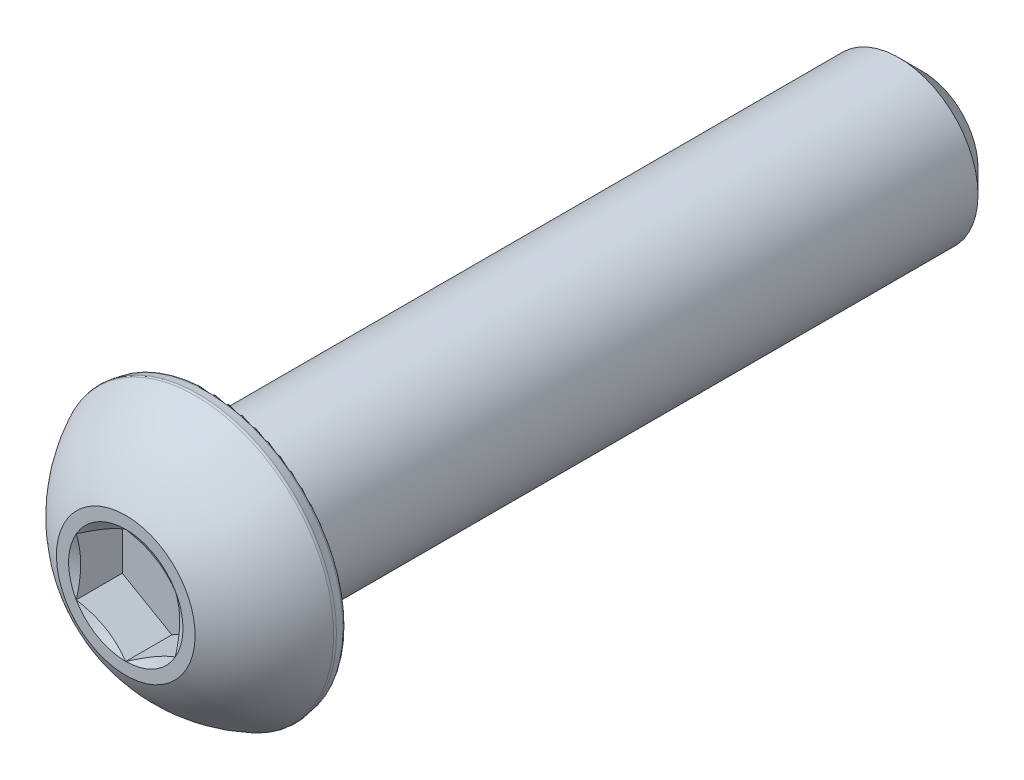
ISO-10303-21;
HEADER;
FILE_DESCRIPTION(('STEP AP214'),'2;1');
FILE_NAME('part.step','',(''),(''),'','','');
FILE_SCHEMA(('AUTOMOTIVE_DESIGN { 1 0 10303 214 1 1 1 1 }'));
ENDSEC;
DATA;
#1=APPLICATION_CONTEXT('core data for automotive mechanical design processes');
#2=APPLICATION_PROTOCOL_DEFINITION('international standard','automotive_design',2000,#1);
#3=PRODUCT_CONTEXT('',#1,'mechanical');
#4=PRODUCT('Part','Part','',(#3));
#5=PRODUCT_RELATED_PRODUCT_CATEGORY('part','',(#4));
#6=PRODUCT_DEFINITION_FORMATION('','',#4);
#7=PRODUCT_DEFINITION_CONTEXT('part definition',#1,'design');
#8=PRODUCT_DEFINITION('design','',#6,#7);
#9=PRODUCT_DEFINITION_SHAPE('','',#8);
#10=(LENGTH_UNIT() NAMED_UNIT(*) SI_UNIT(.MILLI.,.METRE.));
#11=(NAMED_UNIT(*) PLANE_ANGLE_UNIT() SI_UNIT($,.RADIAN.));
#12=(NAMED_UNIT(*) SI_UNIT($,.STERADIAN.) SOLID_ANGLE_UNIT());
#13=UNCERTAINTY_MEASURE_WITH_UNIT(LENGTH_MEASURE(1.E-05),#10,'distance_accuracy_value','');
#14=(GEOMETRIC_REPRESENTATION_CONTEXT(3) GLOBAL_UNCERTAINTY_ASSIGNED_CONTEXT((#13)) GLOBAL_UNIT_ASSIGNED_CONTEXT((#10,
#11,#12)) REPRESENTATION_CONTEXT('',''));
#15=CARTESIAN_POINT('',(0.,0.,0.));
#16=DIRECTION('',(0.,0.,1.));
#17=DIRECTION('',(1.,0.,0.));
#18=AXIS2_PLACEMENT_3D('',#15,#16,#17);
#19=CARTESIAN_POINT('',(0.,0.,15.9639));
#20=DIRECTION('',(0.,0.,-1.));
#21=DIRECTION('',(-1.,0.,0.));
#22=AXIS2_PLACEMENT_3D('',#19,#20,#21);
#23=PLANE('',#22);
#24=CARTESIAN_POINT('',(0.,0.,15.9639));
#25=DIRECTION('',(0.,0.,1.));
#26=DIRECTION('',(1.,0.,0.));
#27=AXIS2_PLACEMENT_3D('',#24,#25,#26);
#28=CIRCLE('',#27,2.29135888084633);
#29=CARTESIAN_POINT('',(-1.984375,1.14567944042316,15.9639));
#30=VERTEX_POINT('',#29);
#31=CARTESIAN_POINT('',(-1.984375,-1.14567944042316,15.9639));
#32=VERTEX_POINT('',#31);
#33=EDGE_CURVE('E87',#30,#32,#28,.T.);
#34=ORIENTED_EDGE('',*,*,#33,.F.);
#35=CARTESIAN_POINT('',(0.,2.29135888084633,15.9639));
#36=VERTEX_POINT('',#35);
#37=EDGE_CURVE('E96',#36,#30,#28,.T.);
#38=ORIENTED_EDGE('',*,*,#37,.F.);
#39=CARTESIAN_POINT('',(1.984375,1.14567944042316,15.9639));
#40=VERTEX_POINT('',#39);
#41=EDGE_CURVE('E47',#40,#36,#28,.T.);
#42=ORIENTED_EDGE('',*,*,#41,.F.);
#43=CARTESIAN_POINT('',(1.984375,-1.14567944042316,15.9639));
#44=VERTEX_POINT('',#43);
#45=EDGE_CURVE('E54',#44,#40,#28,.T.);
#46=ORIENTED_EDGE('',*,*,#45,.F.);
#47=CARTESIAN_POINT('',(0.,-2.29135888084633,15.9639));
#48=VERTEX_POINT('',#47);
#49=EDGE_CURVE('E129',#48,#44,#28,.T.);
#50=ORIENTED_EDGE('',*,*,#49,.F.);
#51=EDGE_CURVE('E97',#32,#48,#28,.T.);
#52=ORIENTED_EDGE('',*,*,#51,.F.);
#53=EDGE_LOOP('',(#34,#38,#42,#46,#50,#52));
#54=FACE_BOUND('',#53,.T.);
#55=CARTESIAN_POINT('',(0.,0.,15.9639));
#56=DIRECTION('',(0.,0.,1.));
#57=DIRECTION('',(1.,0.,0.));
#58=AXIS2_PLACEMENT_3D('',#55,#56,#57);
#59=CIRCLE('',#58,2.778125);
#60=CARTESIAN_POINT('',(0.,2.778125,15.9639));
#61=VERTEX_POINT('',#60);
#62=EDGE_CURVE('E108',#61,#61,#59,.T.);
#63=ORIENTED_EDGE('',*,*,#62,.T.);
#64=EDGE_LOOP('',(#63));
#65=FACE_BOUND('',#64,.T.);
#66=ADVANCED_FACE('F33',(#54,#65),#23,.F.);
#67=CARTESIAN_POINT('',(0.,0.,10.4890681634358));
#68=DIRECTION('',(0.,0.,1.));
#69=DIRECTION('',(0.,1.,0.));
#70=AXIS2_PLACEMENT_3D('',#67,#68,#69);
#71=SPHERICAL_SURFACE('',#70,6.13936170577054);
#72=CARTESIAN_POINT('',(0.,0.,13.1631987678523));
#73=DIRECTION('',(0.,0.,-1.));
#74=DIRECTION('',(-1.,0.,0.));
#75=AXIS2_PLACEMENT_3D('',#72,#73,#74);
#76=CIRCLE('',#75,5.52637201650459);
#77=CARTESIAN_POINT('',(0.,5.52637201650459,13.1631987678523));
#78=VERTEX_POINT('',#77);
#79=EDGE_CURVE('E107',#78,#78,#76,.F.);
#80=CARTESIAN_POINT('',(0.,5.52637201650459,13.1631987678523));
#81=CARTESIAN_POINT('',(0.,5.50825080177499,13.2006483071822));
#82=CARTESIAN_POINT('',(0.,5.48974881162674,13.2379135924003));
#83=CARTESIAN_POINT('',(0.,5.45199117255905,13.3120603788753));
#84=CARTESIAN_POINT('',(0.,5.4327355236396,13.3489418801323));
#85=CARTESIAN_POINT('',(0.,5.39347845909561,13.4223058229478));
#86=CARTESIAN_POINT('',(0.,5.37347704347106,13.4587882645063));
#87=CARTESIAN_POINT('',(0.,5.33273672924781,13.5313390196083));
#88=CARTESIAN_POINT('',(0.,5.31199783064911,13.5674073331517));
#89=CARTESIAN_POINT('',(0.,5.26979111662967,13.639114923668));
#90=CARTESIAN_POINT('',(0.,5.24832330120894,13.6747542006409));
#91=CARTESIAN_POINT('',(0.,5.20466762693299,13.7455889898225));
#92=CARTESIAN_POINT('',(0.,5.18247976807778,13.7807845020311));
#93=CARTESIAN_POINT('',(0.,5.13739317629117,13.8507172160699));
#94=CARTESIAN_POINT('',(0.,5.11449444335977,13.8854544178999));
#95=CARTESIAN_POINT('',(0.,5.06799556699608,13.9544561551948));
#96=CARTESIAN_POINT('',(0.,5.04439542356379,13.9887206906595));
#97=CARTESIAN_POINT('',(0.,4.9965034795341,14.0567629345196));
#98=CARTESIAN_POINT('',(0.,4.97221167893671,14.090540642915));
#99=CARTESIAN_POINT('',(0.,4.9229464597884,14.1575952731416));
#100=CARTESIAN_POINT('',(0.,4.89797304123749,14.1908721949729));
#101=CARTESIAN_POINT('',(0.,4.84735490708145,14.2569114995354));
#102=CARTESIAN_POINT('',(0.,4.82171019147632,14.2896738822665));
#103=CARTESIAN_POINT('',(0.,4.76976006154396,14.3546705687402));
#104=CARTESIAN_POINT('',(0.,4.74345464721673,14.3869048724826));
#105=CARTESIAN_POINT('',(0.,4.69019399122224,14.4508320793321));
#106=CARTESIAN_POINT('',(0.,4.66323874955499,14.4825249824391));
#107=CARTESIAN_POINT('',(0.,4.6086895788204,14.5453562901185));
#108=CARTESIAN_POINT('',(0.,4.58109564975306,14.576494694691));
#109=CARTESIAN_POINT('',(0.,4.52528050811204,14.6382041365628));
#110=CARTESIAN_POINT('',(0.,4.49705929553835,14.6687751738621));
#111=CARTESIAN_POINT('',(0.,4.44000125001922,14.7293372469284));
#112=CARTESIAN_POINT('',(0.,4.41116441707379,14.7593282826952));
#113=CARTESIAN_POINT('',(0.,4.35288704836659,14.8187179581371));
#114=CARTESIAN_POINT('',(0.,4.32344651260482,14.8481165978123));
#115=CARTESIAN_POINT('',(0.,4.26397390531591,14.9063093313346));
#116=CARTESIAN_POINT('',(0.,4.23394183378877,14.9351034251818));
#117=CARTESIAN_POINT('',(0.,4.1732985664873,14.9920751671557));
#118=CARTESIAN_POINT('',(0.,4.14268737071296,15.0202528152824));
#119=CARTESIAN_POINT('',(0.,4.08089850577314,15.075980020685));
#120=CARTESIAN_POINT('',(0.,4.04972083660764,15.1035295779609));
#121=CARTESIAN_POINT('',(0.,3.98681190985103,15.1579892161058));
#122=CARTESIAN_POINT('',(0.,3.95508065225992,15.1848992969748));
#123=CARTESIAN_POINT('',(0.,3.89107766240224,15.23806886103));
#124=CARTESIAN_POINT('',(0.,3.85880593013567,15.2643283442161));
#125=CARTESIAN_POINT('',(0.,3.79373532804182,15.3161858605052));
#126=CARTESIAN_POINT('',(0.,3.76093645821454,15.3417838936082));
#127=CARTESIAN_POINT('',(0.,3.69482513596822,15.3923079306936));
#128=CARTESIAN_POINT('',(0.,3.66151268354918,15.417233934676));
#129=CARTESIAN_POINT('',(0.,3.59438796333499,15.4664036122083));
#130=CARTESIAN_POINT('',(0.,3.56057569553985,15.4906472857581));
#131=CARTESIAN_POINT('',(0.,3.49246531836685,15.5384422831338));
#132=CARTESIAN_POINT('',(0.,3.45816720898899,15.5619936069597));
#133=CARTESIAN_POINT('',(0.,3.3890993231695,15.6083941716134));
#134=CARTESIAN_POINT('',(0.,3.35432954672787,15.6312434124411));
#135=CARTESIAN_POINT('',(0.,3.28433269645534,15.676230368404));
#136=CARTESIAN_POINT('',(0.,3.24910562262445,15.6983680835392));
#137=CARTESIAN_POINT('',(0.,3.17820873538992,15.7419228378885));
#138=CARTESIAN_POINT('',(0.,3.14253892198629,15.7633398771027));
#139=CARTESIAN_POINT('',(0.,3.0707712995602,15.8054444331528));
#140=CARTESIAN_POINT('',(0.,3.03467349053775,15.8261319499888));
#141=CARTESIAN_POINT('',(0.,2.96206478589977,15.8667688941756));
#142=CARTESIAN_POINT('',(0.,2.92555389028424,15.8867183215265));
#143=CARTESIAN_POINT('',(0.,2.85213413627351,15.9258709073101));
#144=CARTESIAN_POINT('',(0.,2.81522527787832,15.9450740657429));
#145=CARTESIAN_POINT('',(0.,2.778125,15.9639));
#146=B_SPLINE_CURVE_WITH_KNOTS('',3,(#80,#81,#82,#83,#84,#85,#86,#87,#88,#89,#90,#91,#92,#93,
#94,#95,#96,#97,#98,#99,#100,#101,#102,#103,#104,#105,#106,#107,#108,#109,#110,#111,#112,#113,
#114,#115,#116,#117,#118,#119,#120,#121,#122,#123,#124,#125,#126,#127,#128,#129,#130,#131,#132,
#133,#134,#135,#136,#137,#138,#139,#140,#141,#142,#143,#144,#145),.UNSPECIFIED.,.F.,.F.,(4,2,2,
2,2,2,2,2,2,2,2,2,2,2,2,2,2,2,2,2,2,2,2,2,2,2,2,2,2,2,2,2,4),(0.,0.124808174209306,
0.249616348418611,0.374424522627916,0.499232696837219,0.624040871046525,0.748849045255829,
0.873657219465135,0.998465393674438,1.12327356788374,1.24808174209305,1.37288991630235,
1.49769809051166,1.62250626472096,1.74731443893027,1.87212261313957,1.99693078734888,
2.12173896155818,2.24654713576749,2.37135530997679,2.4961634841861,2.6209716583954,
2.74577983260471,2.87058800681401,2.99539618102331,3.12020435523262,3.24501252944192,
3.36982070365123,3.49462887786053,3.61943705206984,3.74424522627914,3.86905340048845,
3.99386157469775),.UNSPECIFIED.);
#147=EDGE_CURVE('BSEAM202',#78,#61,#146,.T.);
#148=ORIENTED_EDGE('',*,*,#79,.T.);
#149=ORIENTED_EDGE('',*,*,#62,.F.);
#150=ORIENTED_EDGE('',*,*,#147,.T.);
#151=ORIENTED_EDGE('',*,*,#147,.F.);
#152=EDGE_LOOP('',(#148,#150,#149,#151));
#153=FACE_BOUND('',#152,.T.);
#154=ADVANCED_FACE('F202',(#153),#71,.T.);
#155=CARTESIAN_POINT('',(0.,0.,12.6111));
#156=DIRECTION('',(0.,0.,1.));
#157=DIRECTION('',(1.,0.,0.));
#158=AXIS2_PLACEMENT_3D('',#155,#156,#157);
#159=CONICAL_SURFACE('',#158,5.4612216348621,0.174532925199432);
#160=CARTESIAN_POINT('',(0.,0.,13.0610691915411));
#161=DIRECTION('',(0.,0.,-1.));
#162=DIRECTION('',(-1.,0.,0.));
#163=AXIS2_PLACEMENT_3D('',#160,#161,#162);
#164=CIRCLE('',#163,5.54056334381837);
#165=CARTESIAN_POINT('',(-5.54056334381837,0.,13.0610691915411));
#166=VERTEX_POINT('',#165);
#167=EDGE_CURVE('E41',#166,#166,#164,.T.);
#168=ORIENTED_EDGE('',*,*,#167,.T.);
#169=EDGE_LOOP('',(#168));
#170=FACE_BOUND('',#169,.T.);
#171=CARTESIAN_POINT('',(0.,0.,12.7496296194959));
#172=DIRECTION('',(0.,0.,-1.));
#173=DIRECTION('',(-1.,0.,0.));
#174=AXIS2_PLACEMENT_3D('',#171,#172,#173);
#175=CIRCLE('',#174,5.48564814440651);
#176=CARTESIAN_POINT('',(-5.48564814440651,0.,12.7496296194959));
#177=VERTEX_POINT('',#176);
#178=EDGE_CURVE('E224',#177,#177,#175,.F.);
#179=ORIENTED_EDGE('',*,*,#178,.T.);
#180=EDGE_LOOP('',(#179));
#181=FACE_BOUND('',#180,.T.);
#182=ADVANCED_FACE('F207',(#170,#181),#159,.T.);
#183=CARTESIAN_POINT('',(0.,5.4612216348621,12.6111));
#184=DIRECTION('',(0.,0.,1.));
#185=DIRECTION('',(1.,0.,0.));
#186=AXIS2_PLACEMENT_3D('',#183,#184,#185);
#187=PLANE('',#186);
#188=CARTESIAN_POINT('',(0.,0.,12.6111));
#189=DIRECTION('',(0.,0.,1.));
#190=DIRECTION('',(1.,0.,0.));
#191=AXIS2_PLACEMENT_3D('',#188,#189,#190);
#192=CIRCLE('',#191,5.32055497269154);
#193=CARTESIAN_POINT('',(5.32055497269154,0.,12.6111));
#194=VERTEX_POINT('',#193);
#195=EDGE_CURVE('E11',#194,#194,#192,.F.);
#196=ORIENTED_EDGE('',*,*,#195,.T.);
#197=EDGE_LOOP('',(#196));
#198=FACE_BOUND('',#197,.T.);
#199=CARTESIAN_POINT('',(0.,0.,12.6111));
#200=DIRECTION('',(0.,0.,1.));
#201=DIRECTION('',(1.,0.,0.));
#202=AXIS2_PLACEMENT_3D('',#199,#200,#201);
#203=CIRCLE('',#202,3.175);
#204=CARTESIAN_POINT('',(3.175,0.,12.6111));
#205=VERTEX_POINT('',#204);
#206=EDGE_CURVE('E289',#205,#205,#203,.T.);
#207=ORIENTED_EDGE('',*,*,#206,.T.);
#208=EDGE_LOOP('',(#207));
#209=FACE_BOUND('',#208,.T.);
#210=ADVANCED_FACE('F230',(#198,#209),#187,.F.);
#211=CARTESIAN_POINT('',(0.,0.,15.9639));
#212=DIRECTION('',(0.,0.,1.));
#213=DIRECTION('',(1.,0.,0.));
#214=AXIS2_PLACEMENT_3D('',#211,#212,#213);
#215=CYLINDRICAL_SURFACE('',#214,3.175);
#216=ORIENTED_EDGE('',*,*,#206,.F.);
#217=EDGE_LOOP('',(#216));
#218=FACE_BOUND('',#217,.T.);
#219=CARTESIAN_POINT('',(0.,0.,-15.0114));
#220=DIRECTION('',(0.,0.,1.));
#221=DIRECTION('',(1.,0.,0.));
#222=AXIS2_PLACEMENT_3D('',#219,#220,#221);
#223=CIRCLE('',#222,3.175);
#224=CARTESIAN_POINT('',(3.175,0.,-15.0114));
#225=VERTEX_POINT('',#224);
#226=EDGE_CURVE('E286',#225,#225,#223,.T.);
#227=ORIENTED_EDGE('',*,*,#226,.T.);
#228=EDGE_LOOP('',(#227));
#229=FACE_BOUND('',#228,.T.);
#230=ADVANCED_FACE('F236',(#218,#229),#215,.T.);
#231=CARTESIAN_POINT('',(0.,0.,-15.9639));
#232=DIRECTION('',(0.,0.,1.));
#233=DIRECTION('',(1.,0.,0.));
#234=AXIS2_PLACEMENT_3D('',#231,#232,#233);
#235=CONICAL_SURFACE('',#234,2.2225,0.78539816339744);
#236=ORIENTED_EDGE('',*,*,#226,.F.);
#237=EDGE_LOOP('',(#236));
#238=FACE_BOUND('',#237,.T.);
#239=CARTESIAN_POINT('',(0.,0.,-15.9639));
#240=DIRECTION('',(0.,0.,1.));
#241=DIRECTION('',(1.,0.,0.));
#242=AXIS2_PLACEMENT_3D('',#239,#240,#241);
#243=CIRCLE('',#242,2.2225);
#244=CARTESIAN_POINT('',(2.2225,0.,-15.9639));
#245=VERTEX_POINT('',#244);
#246=EDGE_CURVE('E274',#245,#245,#243,.T.);
#247=ORIENTED_EDGE('',*,*,#246,.T.);
#248=EDGE_LOOP('',(#247));
#249=FACE_BOUND('',#248,.T.);
#250=ADVANCED_FACE('F242',(#238,#249),#235,.T.);
#251=CARTESIAN_POINT('',(0.,0.,-15.9639));
#252=DIRECTION('',(0.,0.,1.));
#253=DIRECTION('',(1.,0.,0.));
#254=AXIS2_PLACEMENT_3D('',#251,#252,#253);
#255=PLANE('',#254);
#256=ORIENTED_EDGE('',*,*,#246,.F.);
#257=EDGE_LOOP('',(#256));
#258=FACE_BOUND('',#257,.T.);
#259=ADVANCED_FACE('F246',(#258),#255,.F.);
#260=CARTESIAN_POINT('',(0.,0.,15.9639));
#261=DIRECTION('',(0.,0.,1.));
#262=DIRECTION('',(1.,0.,0.));
#263=AXIS2_PLACEMENT_3D('',#260,#261,#262);
#264=CONICAL_SURFACE('',#263,2.29135888084633,1.0471975511966);
#265=ORIENTED_EDGE('',*,*,#51,.T.);
#266=CARTESIAN_POINT('',(-1.984575,-1.14556397036933,15.9639666717058));
#267=CARTESIAN_POINT('',(-1.89737036121932,-1.19591159204393,15.9348856822402));
#268=CARTESIAN_POINT('',(-1.809412980695,-1.24669380936686,15.908437208027));
#269=CARTESIAN_POINT('',(-1.63197502132768,-1.34913766297205,15.8622702712065));
#270=CARTESIAN_POINT('',(-1.54249128874368,-1.40080112006751,15.842568142249));
#271=CARTESIAN_POINT('',(-1.36463285198753,-1.50348773640632,15.8118977319315));
#272=CARTESIAN_POINT('',(-1.27628551969391,-1.55449509248823,15.8007253427202));
#273=CARTESIAN_POINT('',(-1.09917497188905,-1.65674991493968,15.7873857960544));
#274=CARTESIAN_POINT('',(-1.01041240048945,-1.7079970094312,15.7852075944601));
#275=CARTESIAN_POINT('',(-0.844542697135339,-1.80376192731311,15.7897295515083));
#276=CARTESIAN_POINT('',(-0.767410784334094,-1.84829405793202,15.7953194134559));
#277=CARTESIAN_POINT('',(-0.61364949281092,-1.93706818098387,15.813038933897));
#278=CARTESIAN_POINT('',(-0.537020646254477,-1.98130986617092,15.8251746503295));
#279=CARTESIAN_POINT('',(-0.382942111493217,-2.07026714969167,15.8555141588444));
#280=CARTESIAN_POINT('',(-0.305511932787318,-2.11497148421093,15.873846609291));
#281=CARTESIAN_POINT('',(-0.151806688756412,-2.20371324822803,15.9154545064002));
#282=CARTESIAN_POINT('',(-0.0755296529470673,-2.24775181538554,15.9387201712824));
#283=CARTESIAN_POINT('',(0.000200000000000562,-2.29147435090016,15.9639666717058));
#284=B_SPLINE_CURVE_WITH_KNOTS('',3,(#266,#267,#268,#269,#270,#271,#272,#273,#274,#275,#276,
#277,#278,#279,#280,#281,#282,#283),.UNSPECIFIED.,.F.,.F.,(4,2,2,2,2,2,2,2,4),(0.,
0.314555137114085,0.629866549668805,0.937373439505931,1.24450262309398,1.51196650590478,
1.77967834211415,2.05332989762155,2.32644383656793),.UNSPECIFIED.);
#285=EDGE_CURVE('E102',#32,#48,#284,.T.);
#286=ORIENTED_EDGE('',*,*,#285,.F.);
#287=EDGE_LOOP('',(#265,#286));
#288=FACE_BOUND('',#287,.T.);
#289=ADVANCED_FACE('F103',(#288),#264,.F.);
#290=ORIENTED_EDGE('',*,*,#49,.T.);
#291=CARTESIAN_POINT('',(-0.000199999999999045,-2.29147435090016,15.9639666717058));
#292=CARTESIAN_POINT('',(0.0870046387806771,-2.24112672922556,15.9348856822402));
#293=CARTESIAN_POINT('',(0.174962019304997,-2.19034451190263,15.908437208027));
#294=CARTESIAN_POINT('',(0.35239997867232,-2.08790065829744,15.8622702712065));
#295=CARTESIAN_POINT('',(0.441883711256319,-2.03623720120198,15.842568142249));
#296=CARTESIAN_POINT('',(0.619742148012469,-1.93355058486317,15.8118977319315));
#297=CARTESIAN_POINT('',(0.708089480306093,-1.88254322878126,15.8007253427202));
#298=CARTESIAN_POINT('',(0.885200028110949,-1.78028840632981,15.7873857960544));
#299=CARTESIAN_POINT('',(0.973962599510546,-1.72904131183829,15.7852075944601));
#300=CARTESIAN_POINT('',(1.13983230286466,-1.63327639395638,15.7897295515083));
#301=CARTESIAN_POINT('',(1.21696421566591,-1.58874426333747,15.7953194134559));
#302=CARTESIAN_POINT('',(1.37072550718908,-1.49997014028562,15.813038933897));
#303=CARTESIAN_POINT('',(1.44735435374552,-1.45572845509857,15.8251746503295));
#304=CARTESIAN_POINT('',(1.60143288850678,-1.36677117157782,15.8555141588444));
#305=CARTESIAN_POINT('',(1.67886306721268,-1.32206683705856,15.873846609291));
#306=CARTESIAN_POINT('',(1.83256831124359,-1.23332507304146,15.9154545064002));
#307=CARTESIAN_POINT('',(1.90884534705293,-1.18928650588395,15.9387201712824));
#308=CARTESIAN_POINT('',(1.984575,-1.14556397036933,15.9639666717058));
#309=B_SPLINE_CURVE_WITH_KNOTS('',3,(#291,#292,#293,#294,#295,#296,#297,#298,#299,#300,#301,
#302,#303,#304,#305,#306,#307,#308),.UNSPECIFIED.,.F.,.F.,(4,2,2,2,2,2,2,2,4),(0.,
0.314555137114085,0.629866549668805,0.937373439505931,1.24450262309398,1.51196650590478,
1.77967834211415,2.05332989762155,2.32644383656793),.UNSPECIFIED.);
#310=EDGE_CURVE('E131',#48,#44,#309,.T.);
#311=ORIENTED_EDGE('',*,*,#310,.F.);
#312=EDGE_LOOP('',(#290,#311));
#313=FACE_BOUND('',#312,.T.);
#314=ADVANCED_FACE('F315',(#313),#264,.F.);
#315=ORIENTED_EDGE('',*,*,#45,.T.);
#316=CARTESIAN_POINT('',(1.984375,-2.96692860034507,16.7017606510924));
#317=CARTESIAN_POINT('',(1.984375,-2.88123645369667,16.6606488017753));
#318=CARTESIAN_POINT('',(1.984375,-2.79533554929687,16.6199639729561));
#319=CARTESIAN_POINT('',(1.984375,-2.62300496253372,16.5396905979452));
#320=CARTESIAN_POINT('',(1.984375,-2.53657518838115,16.5001022490471));
#321=CARTESIAN_POINT('',(1.984375,-2.36258003650985,16.4220429144296));
#322=CARTESIAN_POINT('',(1.984375,-2.27501095051754,16.3835801633989));
#323=CARTESIAN_POINT('',(1.984375,-2.09913795632987,16.3083794270975));
#324=CARTESIAN_POINT('',(1.984375,-2.01083408662377,16.2716413521464));
#325=CARTESIAN_POINT('',(1.984375,-1.83102497893539,16.199413729355));
#326=CARTESIAN_POINT('',(1.984375,-1.73949640320228,16.1639819390739));
#327=CARTESIAN_POINT('',(1.984375,-1.55533214713673,16.0960641835568));
#328=CARTESIAN_POINT('',(1.984375,-1.46269633980312,16.0635785599926));
#329=CARTESIAN_POINT('',(1.984375,-1.27638419434465,16.0024821363592));
#330=CARTESIAN_POINT('',(1.984375,-1.18271082678456,15.9738623752382));
#331=CARTESIAN_POINT('',(1.984375,-0.994021652382586,15.9214763688606));
#332=CARTESIAN_POINT('',(1.984375,-0.89900618522973,15.8977089181985));
#333=CARTESIAN_POINT('',(1.984375,-0.707830512458419,15.8562947393806));
#334=CARTESIAN_POINT('',(1.984375,-0.611673084373238,15.838635440066));
#335=CARTESIAN_POINT('',(1.984375,-0.418283092113671,15.8105930965335));
#336=CARTESIAN_POINT('',(1.984375,-0.321050601045249,15.8002095606059));
#337=CARTESIAN_POINT('',(1.984375,-0.127210752774481,15.7876852009906));
#338=CARTESIAN_POINT('',(1.984375,-0.0306098639781216,15.7854471073686));
#339=CARTESIAN_POINT('',(1.984375,0.162431915887108,15.7891420470322));
#340=CARTESIAN_POINT('',(1.984375,0.2588727966787,15.7950755862751));
#341=CARTESIAN_POINT('',(1.984375,0.496826477184737,15.8192755736915));
#342=CARTESIAN_POINT('',(1.984375,0.63787821182513,15.8420772202142));
#343=CARTESIAN_POINT('',(1.984375,0.917238703702532,15.9008760242614));
#344=CARTESIAN_POINT('',(1.984375,1.05554394232965,15.9368890855425));
#345=CARTESIAN_POINT('',(1.984375,1.26239464896717,15.9984082078903));
#346=CARTESIAN_POINT('',(1.984375,1.33200934564274,16.0204514264146));
#347=CARTESIAN_POINT('',(1.984375,1.47051409380588,16.0665769862575));
#348=CARTESIAN_POINT('',(1.984375,1.53940456776433,16.0906580550061));
#349=CARTESIAN_POINT('',(1.984375,1.67655293465252,16.1405095886895));
#350=CARTESIAN_POINT('',(1.984375,1.74481093998432,16.1662797466023));
#351=CARTESIAN_POINT('',(1.984375,1.88078910071683,16.2192307126816));
#352=CARTESIAN_POINT('',(1.984375,1.94850916300287,16.246411759183));
#353=CARTESIAN_POINT('',(1.984375,2.12136731788459,16.3175336238359));
#354=CARTESIAN_POINT('',(1.984375,2.22615977384557,16.3623135967013));
#355=CARTESIAN_POINT('',(1.984375,2.43479837304527,16.4540321956825));
#356=CARTESIAN_POINT('',(1.984375,2.5386444446916,16.5009709835113));
#357=CARTESIAN_POINT('',(1.984375,2.84907841644386,16.6442645613235));
#358=CARTESIAN_POINT('',(1.984375,3.05452739791263,16.7430818752644));
#359=CARTESIAN_POINT('',(1.984375,3.46367014223903,16.9448608857248));
#360=CARTESIAN_POINT('',(1.984375,3.66736143684958,17.047827527753));
#361=CARTESIAN_POINT('',(1.984375,4.07334844866211,17.2564084165548));
#362=CARTESIAN_POINT('',(1.984375,4.27564433912763,17.3620223267935));
#363=CARTESIAN_POINT('',(1.984375,4.66022184962416,17.5650193368616));
#364=CARTESIAN_POINT('',(1.984375,4.84259034249048,17.6622384272925));
#365=CARTESIAN_POINT('',(1.984375,5.2067407024567,17.8577843204883));
#366=CARTESIAN_POINT('',(1.984375,5.38852254752481,17.9561111642466));
#367=CARTESIAN_POINT('',(1.984375,5.75117247931181,18.153343617507));
#368=CARTESIAN_POINT('',(1.984375,5.93204171415673,18.2522471187779));
#369=CARTESIAN_POINT('',(1.984375,6.29341450955436,18.4506978398903));
#370=CARTESIAN_POINT('',(1.984375,6.47391808874828,18.5502450257738));
#371=CARTESIAN_POINT('',(1.984375,6.65429029614521,18.6500282522634));
#372=B_SPLINE_CURVE_WITH_KNOTS('',3,(#316,#317,#318,#319,#320,#321,#322,#323,#324,#325,#326,
#327,#328,#329,#330,#331,#332,#333,#334,#335,#336,#337,#338,#339,#340,#341,#342,#343,#344,#345,
#346,#347,#348,#349,#350,#351,#352,#353,#354,#355,#356,#357,#358,#359,#360,#361,#362,#363,#364,
#365,#366,#367,#368,#369,#370,#371),.UNSPECIFIED.,.F.,.F.,(4,2,2,2,2,2,2,2,2,2,2,2,2,2,2,2,2,2,
2,2,2,2,2,2,2,2,2,4),(0.,0.285135519832372,0.570322016122787,0.857238463819792,1.14413997577449,
1.43854271801315,1.7329795590899,2.02672173491209,2.32039085060263,2.61345191984504,
2.90649318156653,3.19602335108128,3.48557144803805,3.91334047285799,4.34162614021155,
4.56066589824459,4.77956986852721,4.9984341588919,5.21733554208812,5.55917796423187,
5.90104603503022,6.58489509249958,7.26958483186158,7.95418796687478,8.57417425374278,
9.1941835596094,9.81261585701217,10.431015790458),.UNSPECIFIED.);
#373=EDGE_CURVE('E140',#44,#40,#372,.T.);
#374=ORIENTED_EDGE('',*,*,#373,.F.);
#375=EDGE_LOOP('',(#315,#374));
#376=FACE_BOUND('',#375,.T.);
#377=ADVANCED_FACE('F311',(#376),#264,.F.);
#378=ORIENTED_EDGE('',*,*,#41,.T.);
#379=CARTESIAN_POINT('',(1.984575,1.14556397036933,15.9639666717058));
#380=CARTESIAN_POINT('',(1.89737036121933,1.19591159204393,15.9348856822402));
#381=CARTESIAN_POINT('',(1.80941298069501,1.24669380936686,15.908437208027));
#382=CARTESIAN_POINT('',(1.63197502132768,1.34913766297205,15.8622702712065));
#383=CARTESIAN_POINT('',(1.54249128874368,1.40080112006751,15.842568142249));
#384=CARTESIAN_POINT('',(1.36463285198753,1.50348773640632,15.8118977319315));
#385=CARTESIAN_POINT('',(1.27628551969391,1.55449509248823,15.8007253427202));
#386=CARTESIAN_POINT('',(1.09917497188905,1.65674991493969,15.7873857960544));
#387=CARTESIAN_POINT('',(1.01041240048945,1.70799700943121,15.7852075944601));
#388=CARTESIAN_POINT('',(0.844542697135338,1.80376192731311,15.7897295515083));
#389=CARTESIAN_POINT('',(0.767410784334093,1.84829405793202,15.7953194134559));
#390=CARTESIAN_POINT('',(0.613649492810919,1.93706818098387,15.813038933897));
#391=CARTESIAN_POINT('',(0.537020646254476,1.98130986617092,15.8251746503295));
#392=CARTESIAN_POINT('',(0.382942111493217,2.07026714969168,15.8555141588444));
#393=CARTESIAN_POINT('',(0.305511932787317,2.11497148421093,15.873846609291));
#394=CARTESIAN_POINT('',(0.151806688756411,2.20371324822803,15.9154545064002));
#395=CARTESIAN_POINT('',(0.0755296529470672,2.24775181538554,15.9387201712824));
#396=CARTESIAN_POINT('',(-0.000200000000000544,2.29147435090017,15.9639666717058));
#397=B_SPLINE_CURVE_WITH_KNOTS('',3,(#379,#380,#381,#382,#383,#384,#385,#386,#387,#388,#389,
#390,#391,#392,#393,#394,#395,#396),.UNSPECIFIED.,.F.,.F.,(4,2,2,2,2,2,2,2,4),(0.,
0.314555137114086,0.629866549668807,0.937373439505934,1.24450262309398,1.51196650590478,
1.77967834211415,2.05332989762155,2.32644383656793),.UNSPECIFIED.);
#398=EDGE_CURVE('E167',#40,#36,#397,.T.);
#399=ORIENTED_EDGE('',*,*,#398,.F.);
#400=EDGE_LOOP('',(#378,#399));
#401=FACE_BOUND('',#400,.T.);
#402=ADVANCED_FACE('F307',(#401),#264,.F.);
#403=ORIENTED_EDGE('',*,*,#37,.T.);
#404=CARTESIAN_POINT('',(0.000199999999998825,2.29147435090017,15.9639666717058));
#405=CARTESIAN_POINT('',(-0.0870046387806774,2.24112672922556,15.9348856822402));
#406=CARTESIAN_POINT('',(-0.174962019304997,2.19034451190263,15.908437208027));
#407=CARTESIAN_POINT('',(-0.35239997867232,2.08790065829745,15.8622702712065));
#408=CARTESIAN_POINT('',(-0.441883711256319,2.03623720120198,15.842568142249));
#409=CARTESIAN_POINT('',(-0.619742148012469,1.93355058486317,15.8118977319315));
#410=CARTESIAN_POINT('',(-0.708089480306093,1.88254322878126,15.8007253427202));
#411=CARTESIAN_POINT('',(-0.88520002811095,1.78028840632981,15.7873857960544));
#412=CARTESIAN_POINT('',(-0.973962599510546,1.72904131183829,15.7852075944601));
#413=CARTESIAN_POINT('',(-1.13983230286466,1.63327639395638,15.7897295515083));
#414=CARTESIAN_POINT('',(-1.21696421566591,1.58874426333748,15.7953194134559));
#415=CARTESIAN_POINT('',(-1.37072550718908,1.49997014028563,15.813038933897));
#416=CARTESIAN_POINT('',(-1.44735435374552,1.45572845509857,15.8251746503295));
#417=CARTESIAN_POINT('',(-1.60143288850678,1.36677117157782,15.8555141588444));
#418=CARTESIAN_POINT('',(-1.67886306721268,1.32206683705856,15.873846609291));
#419=CARTESIAN_POINT('',(-1.83256831124359,1.23332507304146,15.9154545064002));
#420=CARTESIAN_POINT('',(-1.90884534705293,1.18928650588395,15.9387201712824));
#421=CARTESIAN_POINT('',(-1.984575,1.14556397036933,15.9639666717058));
#422=B_SPLINE_CURVE_WITH_KNOTS('',3,(#404,#405,#406,#407,#408,#409,#410,#411,#412,#413,#414,
#415,#416,#417,#418,#419,#420,#421),.UNSPECIFIED.,.F.,.F.,(4,2,2,2,2,2,2,2,4),(0.,
0.314555137114085,0.629866549668805,0.937373439505931,1.24450262309398,1.51196650590478,
1.77967834211415,2.05332989762155,2.32644383656793),.UNSPECIFIED.);
#423=EDGE_CURVE('E118',#36,#30,#422,.T.);
#424=ORIENTED_EDGE('',*,*,#423,.F.);
#425=EDGE_LOOP('',(#403,#424));
#426=FACE_BOUND('',#425,.T.);
#427=ADVANCED_FACE('F154',(#426),#264,.F.);
#428=ORIENTED_EDGE('',*,*,#33,.T.);
#429=CARTESIAN_POINT('',(-1.984375,-2.96692860034507,16.7017606510924));
#430=CARTESIAN_POINT('',(-1.984375,-2.88123645369667,16.6606488017753));
#431=CARTESIAN_POINT('',(-1.984375,-2.79533554929687,16.6199639729561));
#432=CARTESIAN_POINT('',(-1.984375,-2.62300496253372,16.5396905979452));
#433=CARTESIAN_POINT('',(-1.984375,-2.53657518838115,16.5001022490471));
#434=CARTESIAN_POINT('',(-1.984375,-2.36258003650985,16.4220429144296));
#435=CARTESIAN_POINT('',(-1.984375,-2.27501095051754,16.3835801633989));
#436=CARTESIAN_POINT('',(-1.984375,-2.09913795632987,16.3083794270975));
#437=CARTESIAN_POINT('',(-1.984375,-2.01083408662377,16.2716413521464));
#438=CARTESIAN_POINT('',(-1.984375,-1.83102497893539,16.199413729355));
#439=CARTESIAN_POINT('',(-1.984375,-1.73949640320228,16.1639819390739));
#440=CARTESIAN_POINT('',(-1.984375,-1.55533214713673,16.0960641835568));
#441=CARTESIAN_POINT('',(-1.984375,-1.46269633980312,16.0635785599926));
#442=CARTESIAN_POINT('',(-1.984375,-1.27638419434466,16.0024821363592));
#443=CARTESIAN_POINT('',(-1.984375,-1.18271082678456,15.9738623752382));
#444=CARTESIAN_POINT('',(-1.984375,-0.994021652382587,15.9214763688606));
#445=CARTESIAN_POINT('',(-1.984375,-0.899006185229731,15.8977089181985));
#446=CARTESIAN_POINT('',(-1.984375,-0.707830512458419,15.8562947393806));
#447=CARTESIAN_POINT('',(-1.984375,-0.611673084373238,15.838635440066));
#448=CARTESIAN_POINT('',(-1.984375,-0.418283092113671,15.8105930965335));
#449=CARTESIAN_POINT('',(-1.984375,-0.321050601045249,15.8002095606059));
#450=CARTESIAN_POINT('',(-1.984375,-0.127210752774482,15.7876852009906));
#451=CARTESIAN_POINT('',(-1.984375,-0.0306098639781225,15.7854471073686));
#452=CARTESIAN_POINT('',(-1.984375,0.162431915887107,15.7891420470322));
#453=CARTESIAN_POINT('',(-1.984375,0.258872796678699,15.7950755862751));
#454=CARTESIAN_POINT('',(-1.984375,0.496826477184735,15.8192755736915));
#455=CARTESIAN_POINT('',(-1.984375,0.637878211825128,15.8420772202142));
#456=CARTESIAN_POINT('',(-1.984375,0.917238703702529,15.9008760242614));
#457=CARTESIAN_POINT('',(-1.984375,1.05554394232965,15.9368890855425));
#458=CARTESIAN_POINT('',(-1.984375,1.26239464896717,15.9984082078903));
#459=CARTESIAN_POINT('',(-1.984375,1.33200934564274,16.0204514264145));
#460=CARTESIAN_POINT('',(-1.984375,1.47051409380588,16.0665769862575));
#461=CARTESIAN_POINT('',(-1.984375,1.53940456776433,16.0906580550061));
#462=CARTESIAN_POINT('',(-1.984375,1.67655293465251,16.1405095886895));
#463=CARTESIAN_POINT('',(-1.984375,1.74481093998432,16.1662797466023));
#464=CARTESIAN_POINT('',(-1.984375,1.88078910071683,16.2192307126816));
#465=CARTESIAN_POINT('',(-1.984375,1.94850916300287,16.246411759183));
#466=CARTESIAN_POINT('',(-1.984375,2.12136731788458,16.3175336238359));
#467=CARTESIAN_POINT('',(-1.984375,2.22615977384557,16.3623135967013));
#468=CARTESIAN_POINT('',(-1.984375,2.43479837304527,16.4540321956825));
#469=CARTESIAN_POINT('',(-1.984375,2.5386444446916,16.5009709835113));
#470=CARTESIAN_POINT('',(-1.984375,2.84907841644385,16.6442645613235));
#471=CARTESIAN_POINT('',(-1.984375,3.05452739791262,16.7430818752644));
#472=CARTESIAN_POINT('',(-1.984375,3.46367014223902,16.9448608857248));
#473=CARTESIAN_POINT('',(-1.984375,3.66736143684957,17.047827527753));
#474=CARTESIAN_POINT('',(-1.984375,4.0733484486621,17.2564084165548));
#475=CARTESIAN_POINT('',(-1.984375,4.27564433912762,17.3620223267935));
#476=CARTESIAN_POINT('',(-1.984375,4.66022184962414,17.5650193368616));
#477=CARTESIAN_POINT('',(-1.984375,4.84259034249047,17.6622384272925));
#478=CARTESIAN_POINT('',(-1.984375,5.20674070245669,17.8577843204883));
#479=CARTESIAN_POINT('',(-1.984375,5.38852254752481,17.9561111642466));
#480=CARTESIAN_POINT('',(-1.984375,5.7511724793118,18.153343617507));
#481=CARTESIAN_POINT('',(-1.984375,5.93204171415673,18.2522471187779));
#482=CARTESIAN_POINT('',(-1.984375,6.29341450955435,18.4506978398903));
#483=CARTESIAN_POINT('',(-1.984375,6.47391808874828,18.5502450257738));
#484=CARTESIAN_POINT('',(-1.984375,6.6542902961452,18.6500282522634));
#485=B_SPLINE_CURVE_WITH_KNOTS('',3,(#429,#430,#431,#432,#433,#434,#435,#436,#437,#438,#439,
#440,#441,#442,#443,#444,#445,#446,#447,#448,#449,#450,#451,#452,#453,#454,#455,#456,#457,#458,
#459,#460,#461,#462,#463,#464,#465,#466,#467,#468,#469,#470,#471,#472,#473,#474,#475,#476,#477,
#478,#479,#480,#481,#482,#483,#484),.UNSPECIFIED.,.F.,.F.,(4,2,2,2,2,2,2,2,2,2,2,2,2,2,2,2,2,2,
2,2,2,2,2,2,2,2,2,4),(0.,0.285135519832372,0.570322016122787,0.857238463819793,1.14413997577449,
1.43854271801315,1.7329795590899,2.02672173491209,2.32039085060263,2.61345191984504,
2.90649318156653,3.19602335108128,3.48557144803805,3.91334047285799,4.34162614021154,
4.56066589824458,4.77956986852721,4.9984341588919,5.21733554208812,5.55917796423187,
5.90104603503021,6.58489509249957,7.26958483186156,7.95418796687477,8.57417425374278,
9.1941835596094,9.81261585701217,10.431015790458),.UNSPECIFIED.);
#486=EDGE_CURVE('E91',#30,#32,#485,.F.);
#487=ORIENTED_EDGE('',*,*,#486,.F.);
#488=EDGE_LOOP('',(#428,#487));
#489=FACE_BOUND('',#488,.T.);
#490=ADVANCED_FACE('F89',(#489),#264,.F.);
#491=CARTESIAN_POINT('',(0.,0.,14.11986));
#492=DIRECTION('',(0.,0.,1.));
#493=DIRECTION('',(1.,0.,0.));
#494=AXIS2_PLACEMENT_3D('',#491,#492,#493);
#495=PLANE('',#494);
#496=DIRECTION('',(0.,-1.,0.));
#497=VECTOR('',#496,1.);
#498=CARTESIAN_POINT('',(-1.984375,1.14567944042316,14.11986));
#499=LINE('',#498,#497);
#500=CARTESIAN_POINT('',(-1.984375,1.14567944042316,14.11986));
#501=VERTEX_POINT('',#500);
#502=CARTESIAN_POINT('',(-1.984375,-1.14567944042316,14.11986));
#503=VERTEX_POINT('',#502);
#504=EDGE_CURVE('E117',#501,#503,#499,.T.);
#505=ORIENTED_EDGE('',*,*,#504,.T.);
#506=DIRECTION('',(0.866025403784439,-0.5,0.));
#507=VECTOR('',#506,1.);
#508=CARTESIAN_POINT('',(-1.984375,-1.14567944042316,14.11986));
#509=LINE('',#508,#507);
#510=CARTESIAN_POINT('',(0.,-2.29135888084633,14.11986));
#511=VERTEX_POINT('',#510);
#512=EDGE_CURVE('E122',#503,#511,#509,.T.);
#513=ORIENTED_EDGE('',*,*,#512,.T.);
#514=DIRECTION('',(0.866025403784438,0.5,0.));
#515=VECTOR('',#514,1.);
#516=CARTESIAN_POINT('',(0.,-2.29135888084633,14.11986));
#517=LINE('',#516,#515);
#518=CARTESIAN_POINT('',(1.984375,-1.14567944042316,14.11986));
#519=VERTEX_POINT('',#518);
#520=EDGE_CURVE('E263',#511,#519,#517,.T.);
#521=ORIENTED_EDGE('',*,*,#520,.T.);
#522=DIRECTION('',(0.,1.,0.));
#523=VECTOR('',#522,1.);
#524=CARTESIAN_POINT('',(1.984375,-1.14567944042316,14.11986));
#525=LINE('',#524,#523);
#526=CARTESIAN_POINT('',(1.984375,1.14567944042316,14.11986));
#527=VERTEX_POINT('',#526);
#528=EDGE_CURVE('E267',#519,#527,#525,.T.);
#529=ORIENTED_EDGE('',*,*,#528,.T.);
#530=DIRECTION('',(-0.866025403784439,0.5,0.));
#531=VECTOR('',#530,1.);
#532=CARTESIAN_POINT('',(1.984375,1.14567944042316,14.11986));
#533=LINE('',#532,#531);
#534=CARTESIAN_POINT('',(0.,2.29135888084633,14.11986));
#535=VERTEX_POINT('',#534);
#536=EDGE_CURVE('E270',#527,#535,#533,.T.);
#537=ORIENTED_EDGE('',*,*,#536,.T.);
#538=DIRECTION('',(-0.866025403784438,-0.5,0.));
#539=VECTOR('',#538,1.);
#540=CARTESIAN_POINT('',(0.,2.29135888084633,14.11986));
#541=LINE('',#540,#539);
#542=EDGE_CURVE('E125',#535,#501,#541,.T.);
#543=ORIENTED_EDGE('',*,*,#542,.T.);
#544=EDGE_LOOP('',(#505,#513,#521,#529,#537,#543));
#545=FACE_BOUND('',#544,.T.);
#546=ADVANCED_FACE('F153',(#545),#495,.T.);
#547=CARTESIAN_POINT('',(-1.984375,-1.14567944042316,14.11986));
#548=DIRECTION('',(-0.5,-0.866025403784439,0.));
#549=DIRECTION('',(0.866025403784439,-0.5,0.));
#550=AXIS2_PLACEMENT_3D('',#547,#548,#549);
#551=PLANE('',#550);
#552=DIRECTION('',(0.,0.,1.));
#553=VECTOR('',#552,1.);
#554=CARTESIAN_POINT('',(-1.984375,-1.14567944042316,14.11986));
#555=LINE('',#554,#553);
#556=EDGE_CURVE('E113',#503,#32,#555,.T.);
#557=ORIENTED_EDGE('',*,*,#556,.T.);
#558=ORIENTED_EDGE('',*,*,#285,.T.);
#559=DIRECTION('',(0.,0.,1.));
#560=VECTOR('',#559,1.);
#561=CARTESIAN_POINT('',(0.,-2.29135888084633,14.11986));
#562=LINE('',#561,#560);
#563=EDGE_CURVE('E124',#511,#48,#562,.T.);
#564=ORIENTED_EDGE('',*,*,#563,.F.);
#565=ORIENTED_EDGE('',*,*,#512,.F.);
#566=EDGE_LOOP('',(#557,#558,#564,#565));
#567=FACE_BOUND('',#566,.T.);
#568=ADVANCED_FACE('F120',(#567),#551,.F.);
#569=CARTESIAN_POINT('',(0.,-2.29135888084633,14.11986));
#570=DIRECTION('',(0.5,-0.866025403784439,0.));
#571=DIRECTION('',(0.866025403784439,0.5,0.));
#572=AXIS2_PLACEMENT_3D('',#569,#570,#571);
#573=PLANE('',#572);
#574=ORIENTED_EDGE('',*,*,#563,.T.);
#575=ORIENTED_EDGE('',*,*,#310,.T.);
#576=DIRECTION('',(0.,0.,1.));
#577=VECTOR('',#576,1.);
#578=CARTESIAN_POINT('',(1.984375,-1.14567944042316,14.11986));
#579=LINE('',#578,#577);
#580=EDGE_CURVE('E281',#519,#44,#579,.T.);
#581=ORIENTED_EDGE('',*,*,#580,.F.);
#582=ORIENTED_EDGE('',*,*,#520,.F.);
#583=EDGE_LOOP('',(#574,#575,#581,#582));
#584=FACE_BOUND('',#583,.T.);
#585=ADVANCED_FACE('F147',(#584),#573,.F.);
#586=CARTESIAN_POINT('',(1.984375,-1.14567944042316,14.11986));
#587=DIRECTION('',(1.,0.,0.));
#588=DIRECTION('',(0.,0.,-1.));
#589=AXIS2_PLACEMENT_3D('',#586,#587,#588);
#590=PLANE('',#589);
#591=ORIENTED_EDGE('',*,*,#580,.T.);
#592=ORIENTED_EDGE('',*,*,#373,.T.);
#593=DIRECTION('',(0.,0.,1.));
#594=VECTOR('',#593,1.);
#595=CARTESIAN_POINT('',(1.984375,1.14567944042316,14.11986));
#596=LINE('',#595,#594);
#597=EDGE_CURVE('E278',#527,#40,#596,.T.);
#598=ORIENTED_EDGE('',*,*,#597,.F.);
#599=ORIENTED_EDGE('',*,*,#528,.F.);
#600=EDGE_LOOP('',(#591,#592,#598,#599));
#601=FACE_BOUND('',#600,.T.);
#602=ADVANCED_FACE('F191',(#601),#590,.F.);
#603=CARTESIAN_POINT('',(1.984375,1.14567944042316,14.11986));
#604=DIRECTION('',(0.5,0.866025403784439,0.));
#605=DIRECTION('',(-0.866025403784439,0.5,0.));
#606=AXIS2_PLACEMENT_3D('',#603,#604,#605);
#607=PLANE('',#606);
#608=ORIENTED_EDGE('',*,*,#597,.T.);
#609=ORIENTED_EDGE('',*,*,#398,.T.);
#610=DIRECTION('',(0.,0.,1.));
#611=VECTOR('',#610,1.);
#612=CARTESIAN_POINT('',(0.,2.29135888084633,14.11986));
#613=LINE('',#612,#611);
#614=EDGE_CURVE('E275',#535,#36,#613,.T.);
#615=ORIENTED_EDGE('',*,*,#614,.F.);
#616=ORIENTED_EDGE('',*,*,#536,.F.);
#617=EDGE_LOOP('',(#608,#609,#615,#616));
#618=FACE_BOUND('',#617,.T.);
#619=ADVANCED_FACE('F187',(#618),#607,.F.);
#620=CARTESIAN_POINT('',(0.,2.29135888084633,14.11986));
#621=DIRECTION('',(-0.5,0.866025403784438,0.));
#622=DIRECTION('',(-0.866025403784439,-0.5,0.));
#623=AXIS2_PLACEMENT_3D('',#620,#621,#622);
#624=PLANE('',#623);
#625=ORIENTED_EDGE('',*,*,#614,.T.);
#626=ORIENTED_EDGE('',*,*,#423,.T.);
#627=DIRECTION('',(0.,0.,1.));
#628=VECTOR('',#627,1.);
#629=CARTESIAN_POINT('',(-1.984375,1.14567944042316,14.11986));
#630=LINE('',#629,#628);
#631=EDGE_CURVE('E115',#501,#30,#630,.T.);
#632=ORIENTED_EDGE('',*,*,#631,.F.);
#633=ORIENTED_EDGE('',*,*,#542,.F.);
#634=EDGE_LOOP('',(#625,#626,#632,#633));
#635=FACE_BOUND('',#634,.T.);
#636=ADVANCED_FACE('F184',(#635),#624,.F.);
#637=CARTESIAN_POINT('',(-1.984375,1.14567944042316,14.11986));
#638=DIRECTION('',(-1.,0.,0.));
#639=DIRECTION('',(0.,-1.,0.));
#640=AXIS2_PLACEMENT_3D('',#637,#638,#639);
#641=PLANE('',#640);
#642=ORIENTED_EDGE('',*,*,#631,.T.);
#643=ORIENTED_EDGE('',*,*,#486,.T.);
#644=ORIENTED_EDGE('',*,*,#556,.F.);
#645=ORIENTED_EDGE('',*,*,#504,.F.);
#646=EDGE_LOOP('',(#642,#643,#644,#645));
#647=FACE_BOUND('',#646,.T.);
#648=ADVANCED_FACE('F111',(#647),#641,.F.);
#649=CARTESIAN_POINT('',(0.,0.,13.0901795720451));
#650=DIRECTION('',(0.,0.,-1.));
#651=DIRECTION('',(-1.,0.,0.));
#652=AXIS2_PLACEMENT_3D('',#649,#650,#651);
#653=TOROIDAL_SURFACE('',#652,5.3754701721034,0.16764);
#654=ORIENTED_EDGE('',*,*,#167,.F.);
#655=EDGE_LOOP('',(#654));
#656=FACE_BOUND('',#655,.T.);
#657=ORIENTED_EDGE('',*,*,#79,.F.);
#658=EDGE_LOOP('',(#657));
#659=FACE_BOUND('',#658,.T.);
#660=ADVANCED_FACE('F211',(#656,#659),#653,.T.);
#661=CARTESIAN_POINT('',(0.,0.,12.77874));
#662=DIRECTION('',(0.,0.,1.));
#663=DIRECTION('',(1.,0.,0.));
#664=AXIS2_PLACEMENT_3D('',#661,#662,#663);
#665=TOROIDAL_SURFACE('',#664,5.32055497269154,0.16764);
#666=ORIENTED_EDGE('',*,*,#195,.F.);
#667=EDGE_LOOP('',(#666));
#668=FACE_BOUND('',#667,.T.);
#669=ORIENTED_EDGE('',*,*,#178,.F.);
#670=EDGE_LOOP('',(#669));
#671=FACE_BOUND('',#670,.T.);
#672=ADVANCED_FACE('F35',(#668,#671),#665,.T.);
#673=CLOSED_SHELL('',(#66,#154,#182,#210,#230,#250,#259,#289,#314,#377,#402,#427,#490,#546,#568,
#585,#602,#619,#636,#648,#660,#672));
#674=MANIFOLD_SOLID_BREP('B2',#673);
#675=ADVANCED_BREP_SHAPE_REPRESENTATION('',(#18,#674),#14);
#676=SHAPE_DEFINITION_REPRESENTATION(#9,#675);
ENDSEC;
END-ISO-10303-21;
